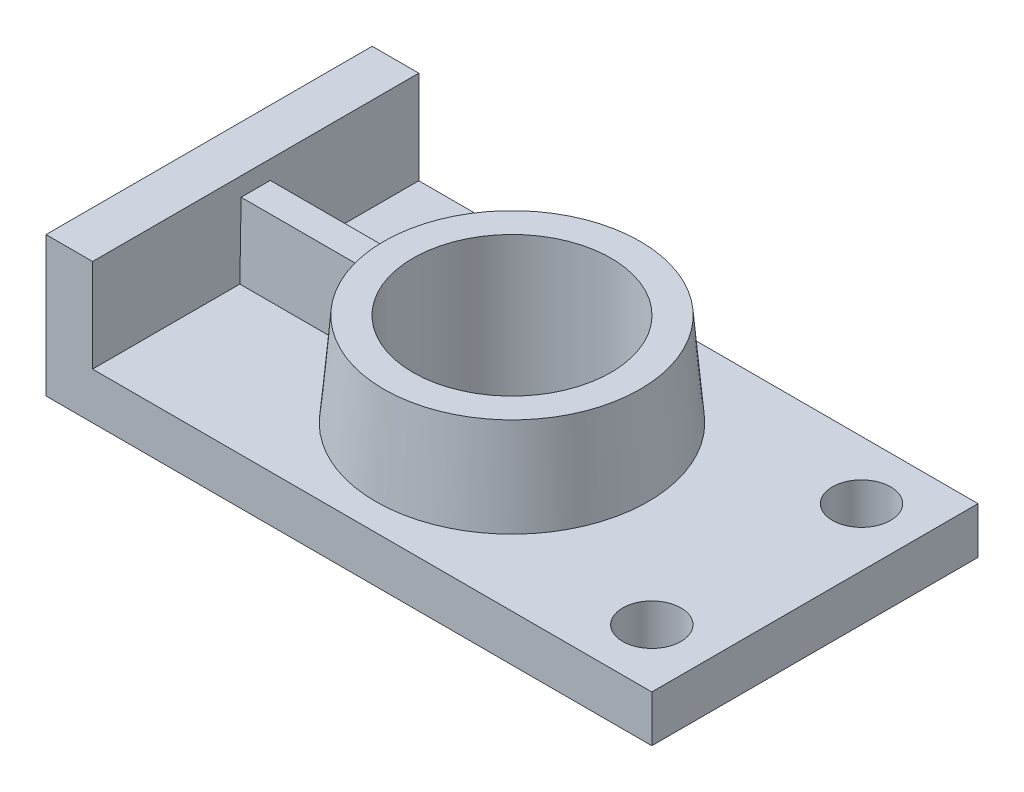
ISO-10303-21;
HEADER;
FILE_DESCRIPTION(('STEP AP214'),'2;1');
FILE_NAME('part.step','',(''),(''),'','','');
FILE_SCHEMA(('AUTOMOTIVE_DESIGN { 1 0 10303 214 1 1 1 1 }'));
ENDSEC;
DATA;
#1=APPLICATION_CONTEXT('core data for automotive mechanical design processes');
#2=APPLICATION_PROTOCOL_DEFINITION('international standard','automotive_design',2000,#1);
#3=PRODUCT_CONTEXT('',#1,'mechanical');
#4=PRODUCT('Part','Part','',(#3));
#5=PRODUCT_RELATED_PRODUCT_CATEGORY('part','',(#4));
#6=PRODUCT_DEFINITION_FORMATION('','',#4);
#7=PRODUCT_DEFINITION_CONTEXT('part definition',#1,'design');
#8=PRODUCT_DEFINITION('design','',#6,#7);
#9=PRODUCT_DEFINITION_SHAPE('','',#8);
#10=(LENGTH_UNIT() NAMED_UNIT(*) SI_UNIT(.MILLI.,.METRE.));
#11=(NAMED_UNIT(*) PLANE_ANGLE_UNIT() SI_UNIT($,.RADIAN.));
#12=(NAMED_UNIT(*) SI_UNIT($,.STERADIAN.) SOLID_ANGLE_UNIT());
#13=UNCERTAINTY_MEASURE_WITH_UNIT(LENGTH_MEASURE(1.E-05),#10,'distance_accuracy_value','');
#14=(GEOMETRIC_REPRESENTATION_CONTEXT(3) GLOBAL_UNCERTAINTY_ASSIGNED_CONTEXT((#13)) GLOBAL_UNIT_ASSIGNED_CONTEXT((#10,
#11,#12)) REPRESENTATION_CONTEXT('',''));
#15=CARTESIAN_POINT('',(0.,0.,0.));
#16=DIRECTION('',(0.,0.,1.));
#17=DIRECTION('',(1.,0.,0.));
#18=AXIS2_PLACEMENT_3D('',#15,#16,#17);
#19=CARTESIAN_POINT('',(0.,0.,-88.9));
#20=DIRECTION('',(0.,-1.,0.));
#21=DIRECTION('',(0.,0.,-1.));
#22=AXIS2_PLACEMENT_3D('',#19,#20,#21);
#23=PLANE('',#22);
#24=CARTESIAN_POINT('',(82.55,0.,-44.4500000000001));
#25=DIRECTION('',(0.,1.,0.));
#26=DIRECTION('',(0.,0.,1.));
#27=AXIS2_PLACEMENT_3D('',#24,#25,#26);
#28=CIRCLE('',#27,26.9875);
#29=CARTESIAN_POINT('',(82.55,0.,-17.4625000000001));
#30=VERTEX_POINT('',#29);
#31=EDGE_CURVE('E130',#30,#30,#28,.T.);
#32=ORIENTED_EDGE('',*,*,#31,.T.);
#33=EDGE_LOOP('',(#32));
#34=FACE_BOUND('',#33,.T.);
#35=DIRECTION('',(0.,0.,1.));
#36=VECTOR('',#35,1.);
#37=CARTESIAN_POINT('',(165.1,0.,-88.9));
#38=LINE('',#37,#36);
#39=CARTESIAN_POINT('',(165.1,0.,-88.9));
#40=VERTEX_POINT('',#39);
#41=CARTESIAN_POINT('',(165.1,0.,0.));
#42=VERTEX_POINT('',#41);
#43=EDGE_CURVE('E202',#40,#42,#38,.T.);
#44=ORIENTED_EDGE('',*,*,#43,.T.);
#45=DIRECTION('',(1.,0.,0.));
#46=VECTOR('',#45,1.);
#47=CARTESIAN_POINT('',(0.,0.,0.));
#48=LINE('',#47,#46);
#49=CARTESIAN_POINT('',(0.,0.,0.));
#50=VERTEX_POINT('',#49);
#51=EDGE_CURVE('E185',#50,#42,#48,.T.);
#52=ORIENTED_EDGE('',*,*,#51,.F.);
#53=DIRECTION('',(0.,0.,1.));
#54=VECTOR('',#53,1.);
#55=CARTESIAN_POINT('',(0.,0.,-88.9));
#56=LINE('',#55,#54);
#57=CARTESIAN_POINT('',(0.,0.,-88.9));
#58=VERTEX_POINT('',#57);
#59=EDGE_CURVE('E120',#58,#50,#56,.T.);
#60=ORIENTED_EDGE('',*,*,#59,.F.);
#61=DIRECTION('',(1.,0.,0.));
#62=VECTOR('',#61,1.);
#63=CARTESIAN_POINT('',(0.,0.,-88.9));
#64=LINE('',#63,#62);
#65=EDGE_CURVE('E187',#58,#40,#64,.T.);
#66=ORIENTED_EDGE('',*,*,#65,.T.);
#67=EDGE_LOOP('',(#44,#52,#60,#66));
#68=FACE_BOUND('',#67,.T.);
#69=CARTESIAN_POINT('',(149.225,0.,-73.025));
#70=DIRECTION('',(0.,1.,0.));
#71=DIRECTION('',(0.,0.,1.));
#72=AXIS2_PLACEMENT_3D('',#69,#70,#71);
#73=CIRCLE('',#72,7.93749999999998);
#74=CARTESIAN_POINT('',(149.225,0.,-65.0875));
#75=VERTEX_POINT('',#74);
#76=EDGE_CURVE('E145',#75,#75,#73,.T.);
#77=ORIENTED_EDGE('',*,*,#76,.T.);
#78=EDGE_LOOP('',(#77));
#79=FACE_BOUND('',#78,.T.);
#80=CARTESIAN_POINT('',(149.225,0.,-15.875));
#81=DIRECTION('',(0.,1.,0.));
#82=DIRECTION('',(0.,0.,1.));
#83=AXIS2_PLACEMENT_3D('',#80,#81,#82);
#84=CIRCLE('',#83,7.93749999999998);
#85=CARTESIAN_POINT('',(149.225,0.,-7.93750000000002));
#86=VERTEX_POINT('',#85);
#87=EDGE_CURVE('E174',#86,#86,#84,.T.);
#88=ORIENTED_EDGE('',*,*,#87,.T.);
#89=EDGE_LOOP('',(#88));
#90=FACE_BOUND('',#89,.T.);
#91=ADVANCED_FACE('F32',(#34,#68,#79,#90),#23,.T.);
#92=CARTESIAN_POINT('',(0.,38.1,-88.9));
#93=DIRECTION('',(-1.,0.,0.));
#94=DIRECTION('',(0.,-1.,0.));
#95=AXIS2_PLACEMENT_3D('',#92,#93,#94);
#96=PLANE('',#95);
#97=ORIENTED_EDGE('',*,*,#59,.T.);
#98=DIRECTION('',(0.,-1.,0.));
#99=VECTOR('',#98,1.);
#100=CARTESIAN_POINT('',(0.,38.1,0.));
#101=LINE('',#100,#99);
#102=CARTESIAN_POINT('',(0.,38.1,0.));
#103=VERTEX_POINT('',#102);
#104=EDGE_CURVE('E191',#103,#50,#101,.T.);
#105=ORIENTED_EDGE('',*,*,#104,.F.);
#106=DIRECTION('',(0.,0.,1.));
#107=VECTOR('',#106,1.);
#108=CARTESIAN_POINT('',(0.,38.1,-88.9));
#109=LINE('',#108,#107);
#110=CARTESIAN_POINT('',(0.,38.1,-88.9));
#111=VERTEX_POINT('',#110);
#112=EDGE_CURVE('E219',#111,#103,#109,.T.);
#113=ORIENTED_EDGE('',*,*,#112,.F.);
#114=DIRECTION('',(0.,-1.,0.));
#115=VECTOR('',#114,1.);
#116=CARTESIAN_POINT('',(0.,38.1,-88.9));
#117=LINE('',#116,#115);
#118=EDGE_CURVE('E199',#111,#58,#117,.T.);
#119=ORIENTED_EDGE('',*,*,#118,.T.);
#120=EDGE_LOOP('',(#97,#105,#113,#119));
#121=FACE_BOUND('',#120,.T.);
#122=ADVANCED_FACE('F245',(#121),#96,.T.);
#123=CARTESIAN_POINT('',(0.,38.1,-88.9));
#124=DIRECTION('',(0.,-1.,0.));
#125=DIRECTION('',(0.,0.,-1.));
#126=AXIS2_PLACEMENT_3D('',#123,#124,#125);
#127=PLANE('',#126);
#128=DIRECTION('',(1.,0.,0.));
#129=VECTOR('',#128,1.);
#130=CARTESIAN_POINT('',(0.,38.1,0.));
#131=LINE('',#130,#129);
#132=CARTESIAN_POINT('',(12.7,38.1,0.));
#133=VERTEX_POINT('',#132);
#134=EDGE_CURVE('E214',#103,#133,#131,.T.);
#135=ORIENTED_EDGE('',*,*,#134,.T.);
#136=DIRECTION('',(0.,0.,1.));
#137=VECTOR('',#136,1.);
#138=CARTESIAN_POINT('',(12.7,38.1,-88.9));
#139=LINE('',#138,#137);
#140=CARTESIAN_POINT('',(12.7,38.1,-88.9));
#141=VERTEX_POINT('',#140);
#142=EDGE_CURVE('E221',#141,#133,#139,.T.);
#143=ORIENTED_EDGE('',*,*,#142,.F.);
#144=DIRECTION('',(1.,0.,0.));
#145=VECTOR('',#144,1.);
#146=CARTESIAN_POINT('',(0.,38.1,-88.9));
#147=LINE('',#146,#145);
#148=EDGE_CURVE('E197',#111,#141,#147,.T.);
#149=ORIENTED_EDGE('',*,*,#148,.F.);
#150=ORIENTED_EDGE('',*,*,#112,.T.);
#151=EDGE_LOOP('',(#135,#143,#149,#150));
#152=FACE_BOUND('',#151,.T.);
#153=ADVANCED_FACE('F254',(#152),#127,.F.);
#154=CARTESIAN_POINT('',(12.7,38.1,-88.9));
#155=DIRECTION('',(-1.,0.,0.));
#156=DIRECTION('',(0.,-1.,0.));
#157=AXIS2_PLACEMENT_3D('',#154,#155,#156);
#158=PLANE('',#157);
#159=DIRECTION('',(0.,0.,1.));
#160=VECTOR('',#159,1.);
#161=CARTESIAN_POINT('',(12.7,12.7,-88.9));
#162=LINE('',#161,#160);
#163=CARTESIAN_POINT('',(12.7,12.7,-40.1265630806587));
#164=VERTEX_POINT('',#163);
#165=CARTESIAN_POINT('',(12.7,12.7,0.));
#166=VERTEX_POINT('',#165);
#167=EDGE_CURVE('E225',#164,#166,#162,.T.);
#168=ORIENTED_EDGE('',*,*,#167,.F.);
#169=DIRECTION('',(0.,-0.999847695156391,0.0174524064372835));
#170=VECTOR('',#169,1.);
#171=CARTESIAN_POINT('',(12.7,38.9433477036106,-40.584642418759));
#172=LINE('',#171,#170);
#173=CARTESIAN_POINT('',(12.7,33.02,-40.4812500000001));
#174=VERTEX_POINT('',#173);
#175=EDGE_CURVE('E161',#164,#174,#172,.F.);
#176=ORIENTED_EDGE('',*,*,#175,.T.);
#177=DIRECTION('',(0.,0.,-1.));
#178=VECTOR('',#177,1.);
#179=CARTESIAN_POINT('',(12.7,33.02,-88.9));
#180=LINE('',#179,#178);
#181=CARTESIAN_POINT('',(12.7,33.02,-48.4187500000001));
#182=VERTEX_POINT('',#181);
#183=EDGE_CURVE('E162',#174,#182,#180,.T.);
#184=ORIENTED_EDGE('',*,*,#183,.T.);
#185=DIRECTION('',(0.,0.999847695156391,0.0174524064372835));
#186=VECTOR('',#185,1.);
#187=CARTESIAN_POINT('',(12.7,37.3920650751844,-48.3424353202423));
#188=LINE('',#187,#186);
#189=CARTESIAN_POINT('',(12.7,12.7,-48.7734369193415));
#190=VERTEX_POINT('',#189);
#191=EDGE_CURVE('E159',#190,#182,#188,.T.);
#192=ORIENTED_EDGE('',*,*,#191,.F.);
#193=CARTESIAN_POINT('',(12.7,12.7,-88.9));
#194=VERTEX_POINT('',#193);
#195=EDGE_CURVE('E116',#194,#190,#162,.T.);
#196=ORIENTED_EDGE('',*,*,#195,.F.);
#197=DIRECTION('',(0.,-1.,0.));
#198=VECTOR('',#197,1.);
#199=CARTESIAN_POINT('',(12.7,38.1,-88.9));
#200=LINE('',#199,#198);
#201=EDGE_CURVE('E195',#141,#194,#200,.T.);
#202=ORIENTED_EDGE('',*,*,#201,.F.);
#203=ORIENTED_EDGE('',*,*,#142,.T.);
#204=DIRECTION('',(0.,-1.,0.));
#205=VECTOR('',#204,1.);
#206=CARTESIAN_POINT('',(12.7,38.1,0.));
#207=LINE('',#206,#205);
#208=EDGE_CURVE('E211',#133,#166,#207,.T.);
#209=ORIENTED_EDGE('',*,*,#208,.T.);
#210=EDGE_LOOP('',(#168,#176,#184,#192,#196,#202,#203,#209));
#211=FACE_BOUND('',#210,.T.);
#212=ADVANCED_FACE('F251',(#211),#158,.F.);
#213=CARTESIAN_POINT('',(0.,12.7,-88.9));
#214=DIRECTION('',(0.,-1.,0.));
#215=DIRECTION('',(0.,0.,-1.));
#216=AXIS2_PLACEMENT_3D('',#213,#214,#215);
#217=PLANE('',#216);
#218=DIRECTION('',(-1.,0.,0.));
#219=VECTOR('',#218,1.);
#220=CARTESIAN_POINT('',(0.,12.7,-48.7734369193415));
#221=LINE('',#220,#219);
#222=CARTESIAN_POINT('',(45.655240798231,12.7,-48.7734369193415));
#223=VERTEX_POINT('',#222);
#224=EDGE_CURVE('E39',#223,#190,#221,.T.);
#225=ORIENTED_EDGE('',*,*,#224,.F.);
#226=CARTESIAN_POINT('',(82.55,12.7,-44.4500000000001));
#227=DIRECTION('',(0.,-1.,0.));
#228=DIRECTION('',(0.,0.,-1.));
#229=AXIS2_PLACEMENT_3D('',#226,#227,#228);
#230=CIRCLE('',#229,37.1472120535585);
#231=CARTESIAN_POINT('',(45.655240798231,12.7,-40.1265630806587));
#232=VERTEX_POINT('',#231);
#233=EDGE_CURVE('E113',#232,#223,#230,.F.);
#234=ORIENTED_EDGE('',*,*,#233,.F.);
#235=DIRECTION('',(1.,0.,0.));
#236=VECTOR('',#235,1.);
#237=CARTESIAN_POINT('',(0.,12.7,-40.1265630806587));
#238=LINE('',#237,#236);
#239=EDGE_CURVE('E11',#232,#164,#238,.F.);
#240=ORIENTED_EDGE('',*,*,#239,.T.);
#241=ORIENTED_EDGE('',*,*,#167,.T.);
#242=DIRECTION('',(1.,0.,0.));
#243=VECTOR('',#242,1.);
#244=CARTESIAN_POINT('',(0.,12.7,0.));
#245=LINE('',#244,#243);
#246=CARTESIAN_POINT('',(165.1,12.7,0.));
#247=VERTEX_POINT('',#246);
#248=EDGE_CURVE('E208',#166,#247,#245,.T.);
#249=ORIENTED_EDGE('',*,*,#248,.T.);
#250=DIRECTION('',(0.,0.,1.));
#251=VECTOR('',#250,1.);
#252=CARTESIAN_POINT('',(165.1,12.7,-88.9));
#253=LINE('',#252,#251);
#254=CARTESIAN_POINT('',(165.1,12.7,-88.9));
#255=VERTEX_POINT('',#254);
#256=EDGE_CURVE('E226',#255,#247,#253,.T.);
#257=ORIENTED_EDGE('',*,*,#256,.F.);
#258=DIRECTION('',(1.,0.,0.));
#259=VECTOR('',#258,1.);
#260=CARTESIAN_POINT('',(0.,12.7,-88.9));
#261=LINE('',#260,#259);
#262=EDGE_CURVE('E193',#194,#255,#261,.T.);
#263=ORIENTED_EDGE('',*,*,#262,.F.);
#264=ORIENTED_EDGE('',*,*,#195,.T.);
#265=EDGE_LOOP('',(#225,#234,#240,#241,#249,#257,#263,#264));
#266=FACE_BOUND('',#265,.T.);
#267=CARTESIAN_POINT('',(149.225,12.7,-73.025));
#268=DIRECTION('',(0.,1.,0.));
#269=DIRECTION('',(0.,0.,1.));
#270=AXIS2_PLACEMENT_3D('',#267,#268,#269);
#271=CIRCLE('',#270,7.93749999999998);
#272=CARTESIAN_POINT('',(149.225,12.7,-65.0875));
#273=VERTEX_POINT('',#272);
#274=EDGE_CURVE('E165',#273,#273,#271,.T.);
#275=ORIENTED_EDGE('',*,*,#274,.F.);
#276=EDGE_LOOP('',(#275));
#277=FACE_BOUND('',#276,.T.);
#278=CARTESIAN_POINT('',(149.225,12.7,-15.875));
#279=DIRECTION('',(0.,1.,0.));
#280=DIRECTION('',(0.,0.,1.));
#281=AXIS2_PLACEMENT_3D('',#278,#279,#280);
#282=CIRCLE('',#281,7.93749999999998);
#283=CARTESIAN_POINT('',(149.225,12.7,-7.93750000000002));
#284=VERTEX_POINT('',#283);
#285=EDGE_CURVE('E172',#284,#284,#282,.T.);
#286=ORIENTED_EDGE('',*,*,#285,.F.);
#287=EDGE_LOOP('',(#286));
#288=FACE_BOUND('',#287,.T.);
#289=ADVANCED_FACE('F111',(#266,#277,#288),#217,.F.);
#290=CARTESIAN_POINT('',(165.1,12.7,-88.9));
#291=DIRECTION('',(-1.,0.,0.));
#292=DIRECTION('',(0.,0.,1.));
#293=AXIS2_PLACEMENT_3D('',#290,#291,#292);
#294=PLANE('',#293);
#295=ORIENTED_EDGE('',*,*,#256,.T.);
#296=DIRECTION('',(0.,-1.,0.));
#297=VECTOR('',#296,1.);
#298=CARTESIAN_POINT('',(165.1,12.7,0.));
#299=LINE('',#298,#297);
#300=EDGE_CURVE('E205',#247,#42,#299,.T.);
#301=ORIENTED_EDGE('',*,*,#300,.T.);
#302=ORIENTED_EDGE('',*,*,#43,.F.);
#303=DIRECTION('',(0.,-1.,0.));
#304=VECTOR('',#303,1.);
#305=CARTESIAN_POINT('',(165.1,12.7,-88.9));
#306=LINE('',#305,#304);
#307=EDGE_CURVE('E190',#255,#40,#306,.T.);
#308=ORIENTED_EDGE('',*,*,#307,.F.);
#309=EDGE_LOOP('',(#295,#301,#302,#308));
#310=FACE_BOUND('',#309,.T.);
#311=ADVANCED_FACE('F236',(#310),#294,.F.);
#312=CARTESIAN_POINT('',(165.1,0.,-88.9));
#313=DIRECTION('',(0.,0.,-1.));
#314=DIRECTION('',(-1.,0.,0.));
#315=AXIS2_PLACEMENT_3D('',#312,#313,#314);
#316=PLANE('',#315);
#317=ORIENTED_EDGE('',*,*,#65,.F.);
#318=ORIENTED_EDGE('',*,*,#118,.F.);
#319=ORIENTED_EDGE('',*,*,#148,.T.);
#320=ORIENTED_EDGE('',*,*,#201,.T.);
#321=ORIENTED_EDGE('',*,*,#262,.T.);
#322=ORIENTED_EDGE('',*,*,#307,.T.);
#323=EDGE_LOOP('',(#317,#318,#319,#320,#321,#322));
#324=FACE_BOUND('',#323,.T.);
#325=ADVANCED_FACE('F249',(#324),#316,.T.);
#326=CARTESIAN_POINT('',(165.1,0.,0.));
#327=DIRECTION('',(0.,0.,-1.));
#328=DIRECTION('',(-1.,0.,0.));
#329=AXIS2_PLACEMENT_3D('',#326,#327,#328);
#330=PLANE('',#329);
#331=ORIENTED_EDGE('',*,*,#51,.T.);
#332=ORIENTED_EDGE('',*,*,#300,.F.);
#333=ORIENTED_EDGE('',*,*,#248,.F.);
#334=ORIENTED_EDGE('',*,*,#208,.F.);
#335=ORIENTED_EDGE('',*,*,#134,.F.);
#336=ORIENTED_EDGE('',*,*,#104,.T.);
#337=EDGE_LOOP('',(#331,#332,#333,#334,#335,#336));
#338=FACE_BOUND('',#337,.T.);
#339=ADVANCED_FACE('F240',(#338),#330,.F.);
#340=CARTESIAN_POINT('',(82.55,38.1,-44.4500000000001));
#341=DIRECTION('',(0.,1.,0.));
#342=DIRECTION('',(0.,0.,1.));
#343=AXIS2_PLACEMENT_3D('',#340,#341,#342);
#344=PLANE('',#343);
#345=CARTESIAN_POINT('',(82.55,38.1,-44.4500000000001));
#346=DIRECTION('',(0.,1.,0.));
#347=DIRECTION('',(0.,0.,1.));
#348=AXIS2_PLACEMENT_3D('',#345,#346,#347);
#349=CIRCLE('',#348,26.9875);
#350=CARTESIAN_POINT('',(82.55,38.1,-17.4625000000001));
#351=VERTEX_POINT('',#350);
#352=EDGE_CURVE('E177',#351,#351,#349,.T.);
#353=ORIENTED_EDGE('',*,*,#352,.F.);
#354=EDGE_LOOP('',(#353));
#355=FACE_BOUND('',#354,.T.);
#356=CARTESIAN_POINT('',(82.55,38.1,-44.4500000000001));
#357=DIRECTION('',(0.,1.,0.));
#358=DIRECTION('',(0.,0.,1.));
#359=AXIS2_PLACEMENT_3D('',#356,#357,#358);
#360=CIRCLE('',#359,34.925);
#361=CARTESIAN_POINT('',(82.55,38.1,-9.52500000000007));
#362=VERTEX_POINT('',#361);
#363=EDGE_CURVE('E129',#362,#362,#360,.T.);
#364=ORIENTED_EDGE('',*,*,#363,.T.);
#365=EDGE_LOOP('',(#364));
#366=FACE_BOUND('',#365,.T.);
#367=ADVANCED_FACE('F276',(#355,#366),#344,.T.);
#368=CARTESIAN_POINT('',(82.55,38.1,-44.4500000000001));
#369=DIRECTION('',(0.,-1.,0.));
#370=DIRECTION('',(0.,0.,1.));
#371=AXIS2_PLACEMENT_3D('',#368,#369,#370);
#372=CONICAL_SURFACE('',#371,34.925,0.0872664625997165);
#373=ORIENTED_EDGE('',*,*,#233,.T.);
#374=CARTESIAN_POINT('',(47.4039437515066,33.0202,-48.4187465089871));
#375=CARTESIAN_POINT('',(47.1124370191614,29.6334712583224,-48.4778620790673));
#376=CARTESIAN_POINT('',(46.8209569728511,26.2467402208144,-48.5369776892214));
#377=CARTESIAN_POINT('',(46.2380502523012,19.4732735541478,-48.6552089896772));
#378=CARTESIAN_POINT('',(45.9466235780617,16.0865379249891,-48.7143246799789));
#379=CARTESIAN_POINT('',(45.6552235898571,12.6998,-48.7734404103544));
#380=B_SPLINE_CURVE_WITH_KNOTS('',3,(#374,#375,#376,#377,#378,#379),.UNSPECIFIED.,.F.,.F.,(4,2,
4),(0.,10.1992951491086,20.3985902981861),.UNSPECIFIED.);
#381=CARTESIAN_POINT('',(47.4039265367787,33.02,-48.4187500000001));
#382=VERTEX_POINT('',#381);
#383=EDGE_CURVE('E127',#382,#223,#380,.T.);
#384=ORIENTED_EDGE('',*,*,#383,.F.);
#385=CARTESIAN_POINT('',(82.55,33.02,-44.4500000000001));
#386=DIRECTION('',(0.,1.,0.));
#387=DIRECTION('',(0.,0.,1.));
#388=AXIS2_PLACEMENT_3D('',#385,#386,#387);
#389=CIRCLE('',#388,35.3694424107117);
#390=CARTESIAN_POINT('',(47.4039265367787,33.02,-40.4812500000001));
#391=VERTEX_POINT('',#390);
#392=EDGE_CURVE('E134',#391,#382,#389,.F.);
#393=ORIENTED_EDGE('',*,*,#392,.F.);
#394=CARTESIAN_POINT('',(47.4039437515066,33.0202,-40.4812534910131));
#395=CARTESIAN_POINT('',(47.1124370191614,29.6334712583224,-40.4221379209328));
#396=CARTESIAN_POINT('',(46.8209569728511,26.2467402208144,-40.3630223107787));
#397=CARTESIAN_POINT('',(46.2380502523012,19.4732735541478,-40.2447910103229));
#398=CARTESIAN_POINT('',(45.9466235780617,16.0865379249891,-40.1856753200212));
#399=CARTESIAN_POINT('',(45.6552235898571,12.6998,-40.1265595896457));
#400=B_SPLINE_CURVE_WITH_KNOTS('',3,(#394,#395,#396,#397,#398,#399),.UNSPECIFIED.,.F.,.F.,(4,2,
4),(0.,10.1992951491086,20.3985902981861),.UNSPECIFIED.);
#401=EDGE_CURVE('E128',#391,#232,#400,.T.);
#402=ORIENTED_EDGE('',*,*,#401,.T.);
#403=EDGE_LOOP('',(#373,#384,#393,#402));
#404=FACE_BOUND('',#403,.T.);
#405=ORIENTED_EDGE('',*,*,#363,.F.);
#406=EDGE_LOOP('',(#405));
#407=FACE_BOUND('',#406,.T.);
#408=ADVANCED_FACE('F124',(#404,#407),#372,.T.);
#409=CARTESIAN_POINT('',(82.55,0.,-44.4500000000001));
#410=DIRECTION('',(0.,1.,0.));
#411=DIRECTION('',(0.,0.,1.));
#412=AXIS2_PLACEMENT_3D('',#409,#410,#411);
#413=CYLINDRICAL_SURFACE('',#412,26.9875);
#414=CARTESIAN_POINT('',(82.55,0.,-17.4625000000001));
#415=CARTESIAN_POINT('',(82.55,0.396875,-17.4625000000001));
#416=CARTESIAN_POINT('',(82.55,0.79375,-17.4625000000001));
#417=CARTESIAN_POINT('',(82.55,1.5875,-17.4625000000001));
#418=CARTESIAN_POINT('',(82.55,1.984375,-17.4625000000001));
#419=CARTESIAN_POINT('',(82.55,2.778125,-17.4625000000001));
#420=CARTESIAN_POINT('',(82.55,3.175,-17.4625000000001));
#421=CARTESIAN_POINT('',(82.55,3.96875,-17.4625000000001));
#422=CARTESIAN_POINT('',(82.55,4.365625,-17.4625000000001));
#423=CARTESIAN_POINT('',(82.55,5.159375,-17.4625000000001));
#424=CARTESIAN_POINT('',(82.55,5.55625,-17.4625000000001));
#425=CARTESIAN_POINT('',(82.55,6.35,-17.4625000000001));
#426=CARTESIAN_POINT('',(82.55,6.746875,-17.4625000000001));
#427=CARTESIAN_POINT('',(82.55,7.540625,-17.4625000000001));
#428=CARTESIAN_POINT('',(82.55,7.9375,-17.4625000000001));
#429=CARTESIAN_POINT('',(82.55,8.73125,-17.4625000000001));
#430=CARTESIAN_POINT('',(82.55,9.128125,-17.4625000000001));
#431=CARTESIAN_POINT('',(82.55,9.921875,-17.4625000000001));
#432=CARTESIAN_POINT('',(82.55,10.31875,-17.4625000000001));
#433=CARTESIAN_POINT('',(82.55,11.1125,-17.4625000000001));
#434=CARTESIAN_POINT('',(82.55,11.509375,-17.4625000000001));
#435=CARTESIAN_POINT('',(82.55,12.303125,-17.4625000000001));
#436=CARTESIAN_POINT('',(82.55,12.7,-17.4625000000001));
#437=CARTESIAN_POINT('',(82.55,13.49375,-17.4625000000001));
#438=CARTESIAN_POINT('',(82.55,13.890625,-17.4625000000001));
#439=CARTESIAN_POINT('',(82.55,14.684375,-17.4625000000001));
#440=CARTESIAN_POINT('',(82.55,15.08125,-17.4625000000001));
#441=CARTESIAN_POINT('',(82.55,15.875,-17.4625000000001));
#442=CARTESIAN_POINT('',(82.55,16.271875,-17.4625000000001));
#443=CARTESIAN_POINT('',(82.55,17.065625,-17.4625000000001));
#444=CARTESIAN_POINT('',(82.55,17.4625,-17.4625000000001));
#445=CARTESIAN_POINT('',(82.55,18.25625,-17.4625000000001));
#446=CARTESIAN_POINT('',(82.55,18.653125,-17.4625000000001));
#447=CARTESIAN_POINT('',(82.55,19.446875,-17.4625000000001));
#448=CARTESIAN_POINT('',(82.55,19.84375,-17.4625000000001));
#449=CARTESIAN_POINT('',(82.55,20.6375,-17.4625000000001));
#450=CARTESIAN_POINT('',(82.55,21.034375,-17.4625000000001));
#451=CARTESIAN_POINT('',(82.55,21.828125,-17.4625000000001));
#452=CARTESIAN_POINT('',(82.55,22.225,-17.4625000000001));
#453=CARTESIAN_POINT('',(82.55,23.01875,-17.4625000000001));
#454=CARTESIAN_POINT('',(82.55,23.415625,-17.4625000000001));
#455=CARTESIAN_POINT('',(82.55,24.209375,-17.4625000000001));
#456=CARTESIAN_POINT('',(82.55,24.60625,-17.4625000000001));
#457=CARTESIAN_POINT('',(82.55,25.4,-17.4625000000001));
#458=CARTESIAN_POINT('',(82.55,25.796875,-17.4625000000001));
#459=CARTESIAN_POINT('',(82.55,26.590625,-17.4625000000001));
#460=CARTESIAN_POINT('',(82.55,26.9875,-17.4625000000001));
#461=CARTESIAN_POINT('',(82.55,27.78125,-17.4625000000001));
#462=CARTESIAN_POINT('',(82.55,28.178125,-17.4625000000001));
#463=CARTESIAN_POINT('',(82.55,28.971875,-17.4625000000001));
#464=CARTESIAN_POINT('',(82.55,29.36875,-17.4625000000001));
#465=CARTESIAN_POINT('',(82.55,30.1625,-17.4625000000001));
#466=CARTESIAN_POINT('',(82.55,30.559375,-17.4625000000001));
#467=CARTESIAN_POINT('',(82.55,31.353125,-17.4625000000001));
#468=CARTESIAN_POINT('',(82.55,31.75,-17.4625000000001));
#469=CARTESIAN_POINT('',(82.55,32.54375,-17.4625000000001));
#470=CARTESIAN_POINT('',(82.55,32.940625,-17.4625000000001));
#471=CARTESIAN_POINT('',(82.55,33.734375,-17.4625000000001));
#472=CARTESIAN_POINT('',(82.55,34.13125,-17.4625000000001));
#473=CARTESIAN_POINT('',(82.55,34.925,-17.4625000000001));
#474=CARTESIAN_POINT('',(82.55,35.321875,-17.4625000000001));
#475=CARTESIAN_POINT('',(82.55,36.115625,-17.4625000000001));
#476=CARTESIAN_POINT('',(82.55,36.5125,-17.4625000000001));
#477=CARTESIAN_POINT('',(82.55,37.30625,-17.4625000000001));
#478=CARTESIAN_POINT('',(82.55,37.703125,-17.4625000000001));
#479=CARTESIAN_POINT('',(82.55,38.1,-17.4625000000001));
#480=B_SPLINE_CURVE_WITH_KNOTS('',3,(#414,#415,#416,#417,#418,#419,#420,#421,#422,#423,#424,
#425,#426,#427,#428,#429,#430,#431,#432,#433,#434,#435,#436,#437,#438,#439,#440,#441,#442,#443,
#444,#445,#446,#447,#448,#449,#450,#451,#452,#453,#454,#455,#456,#457,#458,#459,#460,#461,#462,
#463,#464,#465,#466,#467,#468,#469,#470,#471,#472,#473,#474,#475,#476,#477,#478,#479),
.UNSPECIFIED.,.F.,.F.,(4,2,2,2,2,2,2,2,2,2,2,2,2,2,2,2,2,2,2,2,2,2,2,2,2,2,2,2,2,2,2,2,4),(0.,
1.190625,2.38125,3.571875,4.7625,5.953125,7.14375,8.334375,9.525,10.715625,11.90625,13.096875,
14.2875,15.478125,16.66875,17.859375,19.05,20.240625,21.43125,22.621875,23.8125,25.003125,
26.19375,27.384375,28.575,29.765625,30.95625,32.146875,33.3375,34.528125,35.71875,36.909375,
38.1),.UNSPECIFIED.);
#481=EDGE_CURVE('BSEAM269',#30,#351,#480,.T.);
#482=ORIENTED_EDGE('',*,*,#31,.F.);
#483=ORIENTED_EDGE('',*,*,#352,.T.);
#484=ORIENTED_EDGE('',*,*,#481,.T.);
#485=ORIENTED_EDGE('',*,*,#481,.F.);
#486=EDGE_LOOP('',(#482,#484,#483,#485));
#487=FACE_BOUND('',#486,.T.);
#488=ADVANCED_FACE('F269',(#487),#413,.F.);
#489=CARTESIAN_POINT('',(149.225,0.,-15.875));
#490=DIRECTION('',(0.,1.,0.));
#491=DIRECTION('',(0.,0.,1.));
#492=AXIS2_PLACEMENT_3D('',#489,#490,#491);
#493=CYLINDRICAL_SURFACE('',#492,7.93749999999998);
#494=ORIENTED_EDGE('',*,*,#87,.F.);
#495=EDGE_LOOP('',(#494));
#496=FACE_BOUND('',#495,.T.);
#497=ORIENTED_EDGE('',*,*,#285,.T.);
#498=EDGE_LOOP('',(#497));
#499=FACE_BOUND('',#498,.T.);
#500=ADVANCED_FACE('F272',(#496,#499),#493,.F.);
#501=CARTESIAN_POINT('',(149.225,0.,-73.025));
#502=DIRECTION('',(0.,1.,0.));
#503=DIRECTION('',(0.,0.,1.));
#504=AXIS2_PLACEMENT_3D('',#501,#502,#503);
#505=CYLINDRICAL_SURFACE('',#504,7.93749999999998);
#506=ORIENTED_EDGE('',*,*,#76,.F.);
#507=EDGE_LOOP('',(#506));
#508=FACE_BOUND('',#507,.T.);
#509=ORIENTED_EDGE('',*,*,#274,.T.);
#510=EDGE_LOOP('',(#509));
#511=FACE_BOUND('',#510,.T.);
#512=ADVANCED_FACE('F308',(#508,#511),#505,.F.);
#513=CARTESIAN_POINT('',(42.7788467329118,33.02,-40.4812500000001));
#514=DIRECTION('',(0.,-0.0174524064372835,-0.999847695156391));
#515=DIRECTION('',(0.,0.999847695156391,-0.0174524064372835));
#516=AXIS2_PLACEMENT_3D('',#513,#514,#515);
#517=PLANE('',#516);
#518=ORIENTED_EDGE('',*,*,#239,.F.);
#519=ORIENTED_EDGE('',*,*,#401,.F.);
#520=DIRECTION('',(1.,0.,0.));
#521=VECTOR('',#520,1.);
#522=CARTESIAN_POINT('',(42.7788467329118,33.02,-40.4812500000001));
#523=LINE('',#522,#521);
#524=EDGE_CURVE('E46',#391,#174,#523,.F.);
#525=ORIENTED_EDGE('',*,*,#524,.T.);
#526=ORIENTED_EDGE('',*,*,#175,.F.);
#527=EDGE_LOOP('',(#518,#519,#525,#526));
#528=FACE_BOUND('',#527,.T.);
#529=ADVANCED_FACE('F318',(#528),#517,.F.);
#530=CARTESIAN_POINT('',(42.7788467329118,33.02,-48.4187500000001));
#531=DIRECTION('',(0.,-0.0174524064372835,0.999847695156391));
#532=DIRECTION('',(0.,-0.999847695156391,-0.0174524064372835));
#533=AXIS2_PLACEMENT_3D('',#530,#531,#532);
#534=PLANE('',#533);
#535=DIRECTION('',(1.,0.,0.));
#536=VECTOR('',#535,1.);
#537=CARTESIAN_POINT('',(42.7788467329118,33.02,-48.4187500000001));
#538=LINE('',#537,#536);
#539=EDGE_CURVE('E54',#382,#182,#538,.F.);
#540=ORIENTED_EDGE('',*,*,#539,.F.);
#541=ORIENTED_EDGE('',*,*,#383,.T.);
#542=ORIENTED_EDGE('',*,*,#224,.T.);
#543=ORIENTED_EDGE('',*,*,#191,.T.);
#544=EDGE_LOOP('',(#540,#541,#542,#543));
#545=FACE_BOUND('',#544,.T.);
#546=ADVANCED_FACE('F132',(#545),#534,.F.);
#547=CARTESIAN_POINT('',(21.6504215597711,33.02,-44.4500000000001));
#548=DIRECTION('',(0.,1.,0.));
#549=DIRECTION('',(-1.,0.,0.));
#550=AXIS2_PLACEMENT_3D('',#547,#548,#549);
#551=PLANE('',#550);
#552=ORIENTED_EDGE('',*,*,#183,.F.);
#553=ORIENTED_EDGE('',*,*,#524,.F.);
#554=ORIENTED_EDGE('',*,*,#392,.T.);
#555=ORIENTED_EDGE('',*,*,#539,.T.);
#556=EDGE_LOOP('',(#552,#553,#554,#555));
#557=FACE_BOUND('',#556,.T.);
#558=ADVANCED_FACE('F378',(#557),#551,.T.);
#559=CLOSED_SHELL('',(#91,#122,#153,#212,#289,#311,#325,#339,#367,#408,#488,#500,#512,#529,#546,#558));
#560=MANIFOLD_SOLID_BREP('B2',#559);
#561=ADVANCED_BREP_SHAPE_REPRESENTATION('',(#18,#560),#14);
#562=SHAPE_DEFINITION_REPRESENTATION(#9,#561);
ENDSEC;
END-ISO-10303-21;
